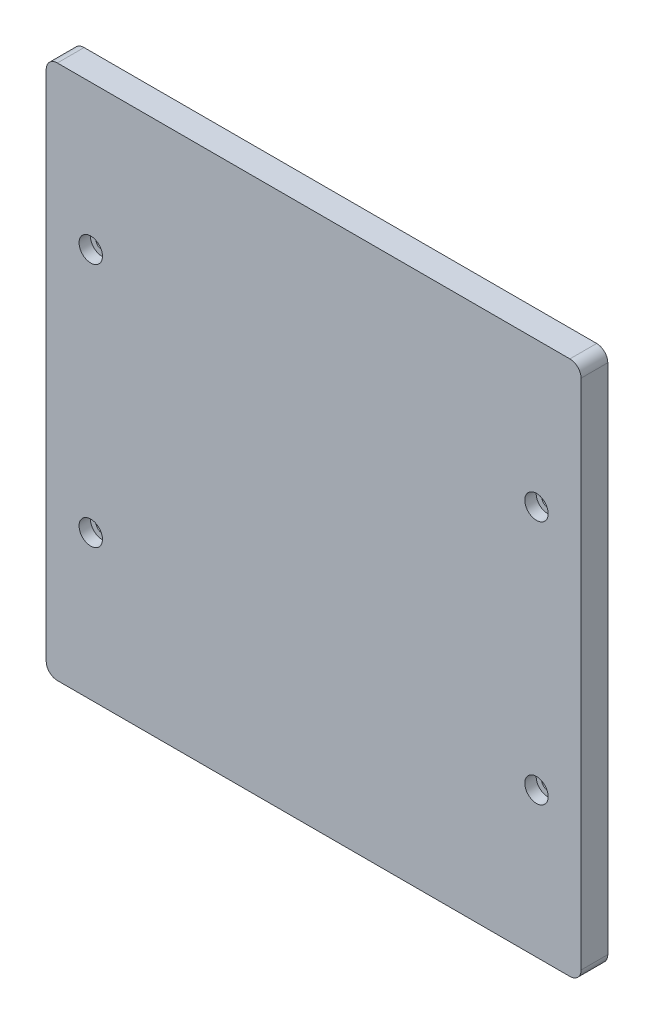
ISO-10303-21;
HEADER;
FILE_DESCRIPTION(('STEP AP214'),'2;1');
FILE_NAME('part.step','',(''),(''),'','','');
FILE_SCHEMA(('AUTOMOTIVE_DESIGN { 1 0 10303 214 1 1 1 1 }'));
ENDSEC;
DATA;
#1=APPLICATION_CONTEXT('core data for automotive mechanical design processes');
#2=APPLICATION_PROTOCOL_DEFINITION('international standard','automotive_design',2000,#1);
#3=PRODUCT_CONTEXT('',#1,'mechanical');
#4=PRODUCT('Part','Part','',(#3));
#5=PRODUCT_RELATED_PRODUCT_CATEGORY('part','',(#4));
#6=PRODUCT_DEFINITION_FORMATION('','',#4);
#7=PRODUCT_DEFINITION_CONTEXT('part definition',#1,'design');
#8=PRODUCT_DEFINITION('design','',#6,#7);
#9=PRODUCT_DEFINITION_SHAPE('','',#8);
#10=(LENGTH_UNIT() NAMED_UNIT(*) SI_UNIT(.MILLI.,.METRE.));
#11=(NAMED_UNIT(*) PLANE_ANGLE_UNIT() SI_UNIT($,.RADIAN.));
#12=(NAMED_UNIT(*) SI_UNIT($,.STERADIAN.) SOLID_ANGLE_UNIT());
#13=UNCERTAINTY_MEASURE_WITH_UNIT(LENGTH_MEASURE(1.E-05),#10,'distance_accuracy_value','');
#14=(GEOMETRIC_REPRESENTATION_CONTEXT(3) GLOBAL_UNCERTAINTY_ASSIGNED_CONTEXT((#13)) GLOBAL_UNIT_ASSIGNED_CONTEXT((#10,
#11,#12)) REPRESENTATION_CONTEXT('',''));
#15=CARTESIAN_POINT('',(0.,0.,0.));
#16=DIRECTION('',(0.,0.,1.));
#17=DIRECTION('',(1.,0.,0.));
#18=AXIS2_PLACEMENT_3D('',#15,#16,#17);
#19=CARTESIAN_POINT('',(100.,55.,186.9));
#20=DIRECTION('',(0.,0.,1.));
#21=DIRECTION('',(1.,0.,0.));
#22=AXIS2_PLACEMENT_3D('',#19,#20,#21);
#23=PLANE('',#22);
#24=CARTESIAN_POINT('',(100.,55.,186.9));
#25=DIRECTION('',(0.,0.,1.));
#26=DIRECTION('',(1.,0.,0.));
#27=AXIS2_PLACEMENT_3D('',#24,#25,#26);
#28=CIRCLE('',#27,2.8);
#29=CARTESIAN_POINT('',(102.8,55.,186.9));
#30=VERTEX_POINT('',#29);
#31=EDGE_CURVE('E241',#30,#30,#28,.T.);
#32=ORIENTED_EDGE('',*,*,#31,.F.);
#33=EDGE_LOOP('',(#32));
#34=FACE_BOUND('',#33,.T.);
#35=CARTESIAN_POINT('',(100.,55.,186.9));
#36=DIRECTION('',(0.,0.,1.));
#37=DIRECTION('',(1.,0.,0.));
#38=AXIS2_PLACEMENT_3D('',#35,#36,#37);
#39=CIRCLE('',#38,5.25);
#40=CARTESIAN_POINT('',(105.25,55.,186.9));
#41=VERTEX_POINT('',#40);
#42=EDGE_CURVE('E11',#41,#41,#39,.T.);
#43=ORIENTED_EDGE('',*,*,#42,.T.);
#44=EDGE_LOOP('',(#43));
#45=FACE_BOUND('',#44,.T.);
#46=ADVANCED_FACE('F16',(#34,#45),#23,.T.);
#47=CARTESIAN_POINT('',(-100.,55.,186.9));
#48=DIRECTION('',(0.,0.,1.));
#49=DIRECTION('',(1.,0.,0.));
#50=AXIS2_PLACEMENT_3D('',#47,#48,#49);
#51=PLANE('',#50);
#52=CARTESIAN_POINT('',(-100.,55.,186.9));
#53=DIRECTION('',(0.,0.,1.));
#54=DIRECTION('',(1.,0.,0.));
#55=AXIS2_PLACEMENT_3D('',#52,#53,#54);
#56=CIRCLE('',#55,2.8);
#57=CARTESIAN_POINT('',(-97.2,55.,186.9));
#58=VERTEX_POINT('',#57);
#59=EDGE_CURVE('E325',#58,#58,#56,.T.);
#60=ORIENTED_EDGE('',*,*,#59,.F.);
#61=EDGE_LOOP('',(#60));
#62=FACE_BOUND('',#61,.T.);
#63=CARTESIAN_POINT('',(-100.,55.,186.9));
#64=DIRECTION('',(0.,0.,1.));
#65=DIRECTION('',(1.,0.,0.));
#66=AXIS2_PLACEMENT_3D('',#63,#64,#65);
#67=CIRCLE('',#66,5.25);
#68=CARTESIAN_POINT('',(-94.75,55.,186.9));
#69=VERTEX_POINT('',#68);
#70=EDGE_CURVE('E39',#69,#69,#67,.T.);
#71=ORIENTED_EDGE('',*,*,#70,.T.);
#72=EDGE_LOOP('',(#71));
#73=FACE_BOUND('',#72,.T.);
#74=ADVANCED_FACE('F389',(#62,#73),#51,.T.);
#75=CARTESIAN_POINT('',(100.,-55.,186.9));
#76=DIRECTION('',(0.,0.,1.));
#77=DIRECTION('',(1.,0.,0.));
#78=AXIS2_PLACEMENT_3D('',#75,#76,#77);
#79=PLANE('',#78);
#80=CARTESIAN_POINT('',(100.,-55.,186.9));
#81=DIRECTION('',(0.,0.,1.));
#82=DIRECTION('',(1.,0.,0.));
#83=AXIS2_PLACEMENT_3D('',#80,#81,#82);
#84=CIRCLE('',#83,2.8);
#85=CARTESIAN_POINT('',(102.8,-55.,186.9));
#86=VERTEX_POINT('',#85);
#87=EDGE_CURVE('E275',#86,#86,#84,.T.);
#88=ORIENTED_EDGE('',*,*,#87,.F.);
#89=EDGE_LOOP('',(#88));
#90=FACE_BOUND('',#89,.T.);
#91=CARTESIAN_POINT('',(100.,-55.,186.9));
#92=DIRECTION('',(0.,0.,1.));
#93=DIRECTION('',(1.,0.,0.));
#94=AXIS2_PLACEMENT_3D('',#91,#92,#93);
#95=CIRCLE('',#94,5.25);
#96=CARTESIAN_POINT('',(105.25,-55.,186.9));
#97=VERTEX_POINT('',#96);
#98=EDGE_CURVE('E301',#97,#97,#95,.T.);
#99=ORIENTED_EDGE('',*,*,#98,.T.);
#100=EDGE_LOOP('',(#99));
#101=FACE_BOUND('',#100,.T.);
#102=ADVANCED_FACE('F394',(#90,#101),#79,.T.);
#103=CARTESIAN_POINT('',(-100.,-55.,186.9));
#104=DIRECTION('',(0.,0.,1.));
#105=DIRECTION('',(1.,0.,0.));
#106=AXIS2_PLACEMENT_3D('',#103,#104,#105);
#107=PLANE('',#106);
#108=CARTESIAN_POINT('',(-100.,-55.,186.9));
#109=DIRECTION('',(0.,0.,1.));
#110=DIRECTION('',(1.,0.,0.));
#111=AXIS2_PLACEMENT_3D('',#108,#109,#110);
#112=CIRCLE('',#111,2.8);
#113=CARTESIAN_POINT('',(-97.2,-55.,186.9));
#114=VERTEX_POINT('',#113);
#115=EDGE_CURVE('E276',#114,#114,#112,.T.);
#116=ORIENTED_EDGE('',*,*,#115,.F.);
#117=EDGE_LOOP('',(#116));
#118=FACE_BOUND('',#117,.T.);
#119=CARTESIAN_POINT('',(-100.,-55.,186.9));
#120=DIRECTION('',(0.,0.,1.));
#121=DIRECTION('',(1.,0.,0.));
#122=AXIS2_PLACEMENT_3D('',#119,#120,#121);
#123=CIRCLE('',#122,5.25);
#124=CARTESIAN_POINT('',(-94.75,-55.,186.9));
#125=VERTEX_POINT('',#124);
#126=EDGE_CURVE('E302',#125,#125,#123,.T.);
#127=ORIENTED_EDGE('',*,*,#126,.T.);
#128=EDGE_LOOP('',(#127));
#129=FACE_BOUND('',#128,.T.);
#130=ADVANCED_FACE('F413',(#118,#129),#107,.T.);
#131=CARTESIAN_POINT('',(100.,55.,186.9));
#132=DIRECTION('',(0.,0.,1.));
#133=DIRECTION('',(1.,0.,0.));
#134=AXIS2_PLACEMENT_3D('',#131,#132,#133);
#135=CYLINDRICAL_SURFACE('',#134,5.25);
#136=DIRECTION('',(0.,0.,1.));
#137=VECTOR('',#136,1.);
#138=CARTESIAN_POINT('',(105.25,55.,186.9));
#139=LINE('',#138,#137);
#140=CARTESIAN_POINT('',(105.25,55.,192.));
#141=VERTEX_POINT('',#140);
#142=EDGE_CURVE('E24',#41,#141,#139,.T.);
#143=ORIENTED_EDGE('',*,*,#142,.F.);
#144=ORIENTED_EDGE('',*,*,#42,.F.);
#145=ORIENTED_EDGE('',*,*,#142,.T.);
#146=CARTESIAN_POINT('',(100.,55.,192.));
#147=DIRECTION('',(0.,0.,1.));
#148=DIRECTION('',(1.,0.,0.));
#149=AXIS2_PLACEMENT_3D('',#146,#147,#148);
#150=CIRCLE('',#149,5.25);
#151=EDGE_CURVE('E224',#141,#141,#150,.T.);
#152=ORIENTED_EDGE('',*,*,#151,.T.);
#153=EDGE_LOOP('',(#143,#144,#145,#152));
#154=FACE_BOUND('',#153,.T.);
#155=ADVANCED_FACE('F345',(#154),#135,.F.);
#156=CARTESIAN_POINT('',(-100.,55.,186.9));
#157=DIRECTION('',(0.,0.,1.));
#158=DIRECTION('',(1.,0.,0.));
#159=AXIS2_PLACEMENT_3D('',#156,#157,#158);
#160=CYLINDRICAL_SURFACE('',#159,5.25);
#161=DIRECTION('',(0.,0.,1.));
#162=VECTOR('',#161,1.);
#163=CARTESIAN_POINT('',(-94.75,55.,186.9));
#164=LINE('',#163,#162);
#165=CARTESIAN_POINT('',(-94.75,55.,192.));
#166=VERTEX_POINT('',#165);
#167=EDGE_CURVE('E337',#69,#166,#164,.T.);
#168=ORIENTED_EDGE('',*,*,#167,.F.);
#169=ORIENTED_EDGE('',*,*,#70,.F.);
#170=ORIENTED_EDGE('',*,*,#167,.T.);
#171=CARTESIAN_POINT('',(-100.,55.,192.));
#172=DIRECTION('',(0.,0.,1.));
#173=DIRECTION('',(1.,0.,0.));
#174=AXIS2_PLACEMENT_3D('',#171,#172,#173);
#175=CIRCLE('',#174,5.25);
#176=EDGE_CURVE('E229',#166,#166,#175,.T.);
#177=ORIENTED_EDGE('',*,*,#176,.T.);
#178=EDGE_LOOP('',(#168,#169,#170,#177));
#179=FACE_BOUND('',#178,.T.);
#180=ADVANCED_FACE('F430',(#179),#160,.F.);
#181=CARTESIAN_POINT('',(100.,-55.,186.9));
#182=DIRECTION('',(0.,0.,1.));
#183=DIRECTION('',(1.,0.,0.));
#184=AXIS2_PLACEMENT_3D('',#181,#182,#183);
#185=CYLINDRICAL_SURFACE('',#184,5.25);
#186=DIRECTION('',(0.,0.,1.));
#187=VECTOR('',#186,1.);
#188=CARTESIAN_POINT('',(105.25,-55.,186.9));
#189=LINE('',#188,#187);
#190=CARTESIAN_POINT('',(105.25,-55.,192.));
#191=VERTEX_POINT('',#190);
#192=EDGE_CURVE('E298',#97,#191,#189,.T.);
#193=ORIENTED_EDGE('',*,*,#192,.F.);
#194=ORIENTED_EDGE('',*,*,#98,.F.);
#195=ORIENTED_EDGE('',*,*,#192,.T.);
#196=CARTESIAN_POINT('',(100.,-55.,192.));
#197=DIRECTION('',(0.,0.,1.));
#198=DIRECTION('',(1.,0.,0.));
#199=AXIS2_PLACEMENT_3D('',#196,#197,#198);
#200=CIRCLE('',#199,5.25);
#201=EDGE_CURVE('E297',#191,#191,#200,.T.);
#202=ORIENTED_EDGE('',*,*,#201,.T.);
#203=EDGE_LOOP('',(#193,#194,#195,#202));
#204=FACE_BOUND('',#203,.T.);
#205=ADVANCED_FACE('F422',(#204),#185,.F.);
#206=CARTESIAN_POINT('',(-100.,-55.,186.9));
#207=DIRECTION('',(0.,0.,1.));
#208=DIRECTION('',(1.,0.,0.));
#209=AXIS2_PLACEMENT_3D('',#206,#207,#208);
#210=CYLINDRICAL_SURFACE('',#209,5.25);
#211=DIRECTION('',(0.,0.,1.));
#212=VECTOR('',#211,1.);
#213=CARTESIAN_POINT('',(-94.75,-55.,186.9));
#214=LINE('',#213,#212);
#215=CARTESIAN_POINT('',(-94.75,-55.,192.));
#216=VERTEX_POINT('',#215);
#217=EDGE_CURVE('E244',#125,#216,#214,.T.);
#218=ORIENTED_EDGE('',*,*,#217,.F.);
#219=ORIENTED_EDGE('',*,*,#126,.F.);
#220=ORIENTED_EDGE('',*,*,#217,.T.);
#221=CARTESIAN_POINT('',(-100.,-55.,192.));
#222=DIRECTION('',(0.,0.,1.));
#223=DIRECTION('',(1.,0.,0.));
#224=AXIS2_PLACEMENT_3D('',#221,#222,#223);
#225=CIRCLE('',#224,5.25);
#226=EDGE_CURVE('E293',#216,#216,#225,.T.);
#227=ORIENTED_EDGE('',*,*,#226,.T.);
#228=EDGE_LOOP('',(#218,#219,#220,#227));
#229=FACE_BOUND('',#228,.T.);
#230=ADVANCED_FACE('F420',(#229),#210,.F.);
#231=CARTESIAN_POINT('',(100.,55.,179.));
#232=DIRECTION('',(0.,0.,1.));
#233=DIRECTION('',(1.,0.,0.));
#234=AXIS2_PLACEMENT_3D('',#231,#232,#233);
#235=CYLINDRICAL_SURFACE('',#234,2.8);
#236=DIRECTION('',(0.,0.,1.));
#237=VECTOR('',#236,1.);
#238=CARTESIAN_POINT('',(102.8,55.,179.));
#239=LINE('',#238,#237);
#240=CARTESIAN_POINT('',(102.8,55.,180.));
#241=VERTEX_POINT('',#240);
#242=EDGE_CURVE('E245',#241,#30,#239,.T.);
#243=ORIENTED_EDGE('',*,*,#242,.F.);
#244=CARTESIAN_POINT('',(100.,55.,180.));
#245=DIRECTION('',(0.,0.,1.));
#246=DIRECTION('',(1.,0.,0.));
#247=AXIS2_PLACEMENT_3D('',#244,#245,#246);
#248=CIRCLE('',#247,2.8);
#249=EDGE_CURVE('E267',#241,#241,#248,.T.);
#250=ORIENTED_EDGE('',*,*,#249,.F.);
#251=ORIENTED_EDGE('',*,*,#242,.T.);
#252=ORIENTED_EDGE('',*,*,#31,.T.);
#253=EDGE_LOOP('',(#243,#250,#251,#252));
#254=FACE_BOUND('',#253,.T.);
#255=ADVANCED_FACE('F399',(#254),#235,.F.);
#256=CARTESIAN_POINT('',(-100.,55.,179.));
#257=DIRECTION('',(0.,0.,1.));
#258=DIRECTION('',(1.,0.,0.));
#259=AXIS2_PLACEMENT_3D('',#256,#257,#258);
#260=CYLINDRICAL_SURFACE('',#259,2.8);
#261=DIRECTION('',(0.,0.,1.));
#262=VECTOR('',#261,1.);
#263=CARTESIAN_POINT('',(-97.2,55.,179.));
#264=LINE('',#263,#262);
#265=CARTESIAN_POINT('',(-97.2,55.,180.));
#266=VERTEX_POINT('',#265);
#267=EDGE_CURVE('E321',#266,#58,#264,.T.);
#268=ORIENTED_EDGE('',*,*,#267,.F.);
#269=CARTESIAN_POINT('',(-100.,55.,180.));
#270=DIRECTION('',(0.,0.,1.));
#271=DIRECTION('',(1.,0.,0.));
#272=AXIS2_PLACEMENT_3D('',#269,#270,#271);
#273=CIRCLE('',#272,2.8);
#274=EDGE_CURVE('E263',#266,#266,#273,.T.);
#275=ORIENTED_EDGE('',*,*,#274,.F.);
#276=ORIENTED_EDGE('',*,*,#267,.T.);
#277=ORIENTED_EDGE('',*,*,#59,.T.);
#278=EDGE_LOOP('',(#268,#275,#276,#277));
#279=FACE_BOUND('',#278,.T.);
#280=ADVANCED_FACE('F428',(#279),#260,.F.);
#281=CARTESIAN_POINT('',(100.,-55.,179.));
#282=DIRECTION('',(0.,0.,1.));
#283=DIRECTION('',(1.,0.,0.));
#284=AXIS2_PLACEMENT_3D('',#281,#282,#283);
#285=CYLINDRICAL_SURFACE('',#284,2.8);
#286=DIRECTION('',(0.,0.,1.));
#287=VECTOR('',#286,1.);
#288=CARTESIAN_POINT('',(102.8,-55.,179.));
#289=LINE('',#288,#287);
#290=CARTESIAN_POINT('',(102.8,-55.,180.));
#291=VERTEX_POINT('',#290);
#292=EDGE_CURVE('E271',#291,#86,#289,.T.);
#293=ORIENTED_EDGE('',*,*,#292,.F.);
#294=CARTESIAN_POINT('',(100.,-55.,180.));
#295=DIRECTION('',(0.,0.,1.));
#296=DIRECTION('',(1.,0.,0.));
#297=AXIS2_PLACEMENT_3D('',#294,#295,#296);
#298=CIRCLE('',#297,2.8);
#299=EDGE_CURVE('E207',#291,#291,#298,.T.);
#300=ORIENTED_EDGE('',*,*,#299,.F.);
#301=ORIENTED_EDGE('',*,*,#292,.T.);
#302=ORIENTED_EDGE('',*,*,#87,.T.);
#303=EDGE_LOOP('',(#293,#300,#301,#302));
#304=FACE_BOUND('',#303,.T.);
#305=ADVANCED_FACE('F517',(#304),#285,.F.);
#306=CARTESIAN_POINT('',(-100.,-55.,179.));
#307=DIRECTION('',(0.,0.,1.));
#308=DIRECTION('',(1.,0.,0.));
#309=AXIS2_PLACEMENT_3D('',#306,#307,#308);
#310=CYLINDRICAL_SURFACE('',#309,2.8);
#311=DIRECTION('',(0.,0.,1.));
#312=VECTOR('',#311,1.);
#313=CARTESIAN_POINT('',(-97.2,-55.,179.));
#314=LINE('',#313,#312);
#315=CARTESIAN_POINT('',(-97.2,-55.,180.));
#316=VERTEX_POINT('',#315);
#317=EDGE_CURVE('E217',#316,#114,#314,.T.);
#318=ORIENTED_EDGE('',*,*,#317,.F.);
#319=CARTESIAN_POINT('',(-100.,-55.,180.));
#320=DIRECTION('',(0.,0.,1.));
#321=DIRECTION('',(1.,0.,0.));
#322=AXIS2_PLACEMENT_3D('',#319,#320,#321);
#323=CIRCLE('',#322,2.8);
#324=EDGE_CURVE('E204',#316,#316,#323,.T.);
#325=ORIENTED_EDGE('',*,*,#324,.F.);
#326=ORIENTED_EDGE('',*,*,#317,.T.);
#327=ORIENTED_EDGE('',*,*,#115,.T.);
#328=EDGE_LOOP('',(#318,#325,#326,#327));
#329=FACE_BOUND('',#328,.T.);
#330=ADVANCED_FACE('F410',(#329),#310,.F.);
#331=CARTESIAN_POINT('',(120.,-115.,180.));
#332=DIRECTION('',(-1.,0.,0.));
#333=DIRECTION('',(0.,0.,1.));
#334=AXIS2_PLACEMENT_3D('',#331,#332,#333);
#335=PLANE('',#334);
#336=DIRECTION('',(0.,1.,0.));
#337=VECTOR('',#336,1.);
#338=CARTESIAN_POINT('',(120.,0.,180.));
#339=LINE('',#338,#337);
#340=CARTESIAN_POINT('',(120.,-115.,180.));
#341=VERTEX_POINT('',#340);
#342=CARTESIAN_POINT('',(120.,115.,180.));
#343=VERTEX_POINT('',#342);
#344=EDGE_CURVE('E211',#341,#343,#339,.T.);
#345=ORIENTED_EDGE('',*,*,#344,.T.);
#346=DIRECTION('',(0.,0.,1.));
#347=VECTOR('',#346,1.);
#348=CARTESIAN_POINT('',(120.,115.,180.));
#349=LINE('',#348,#347);
#350=CARTESIAN_POINT('',(120.,115.,192.));
#351=VERTEX_POINT('',#350);
#352=EDGE_CURVE('E214',#343,#351,#349,.T.);
#353=ORIENTED_EDGE('',*,*,#352,.T.);
#354=DIRECTION('',(0.,1.,0.));
#355=VECTOR('',#354,1.);
#356=CARTESIAN_POINT('',(120.,0.,192.));
#357=LINE('',#356,#355);
#358=CARTESIAN_POINT('',(120.,-115.,192.));
#359=VERTEX_POINT('',#358);
#360=EDGE_CURVE('E250',#359,#351,#357,.T.);
#361=ORIENTED_EDGE('',*,*,#360,.F.);
#362=DIRECTION('',(0.,0.,1.));
#363=VECTOR('',#362,1.);
#364=CARTESIAN_POINT('',(120.,-115.,180.));
#365=LINE('',#364,#363);
#366=EDGE_CURVE('E218',#341,#359,#365,.T.);
#367=ORIENTED_EDGE('',*,*,#366,.F.);
#368=EDGE_LOOP('',(#345,#353,#361,#367));
#369=FACE_BOUND('',#368,.T.);
#370=ADVANCED_FACE('F374',(#369),#335,.F.);
#371=CARTESIAN_POINT('',(115.,115.,180.));
#372=DIRECTION('',(0.,0.,-1.));
#373=DIRECTION('',(-1.,0.,0.));
#374=AXIS2_PLACEMENT_3D('',#371,#372,#373);
#375=CYLINDRICAL_SURFACE('',#374,5.);
#376=DIRECTION('',(0.,0.,1.));
#377=VECTOR('',#376,1.);
#378=CARTESIAN_POINT('',(115.,120.,180.));
#379=LINE('',#378,#377);
#380=CARTESIAN_POINT('',(115.,120.,180.));
#381=VERTEX_POINT('',#380);
#382=CARTESIAN_POINT('',(115.,120.,192.));
#383=VERTEX_POINT('',#382);
#384=EDGE_CURVE('E311',#381,#383,#379,.T.);
#385=ORIENTED_EDGE('',*,*,#384,.T.);
#386=CARTESIAN_POINT('',(115.,115.,192.));
#387=DIRECTION('',(0.,0.,-1.));
#388=DIRECTION('',(-1.,0.,0.));
#389=AXIS2_PLACEMENT_3D('',#386,#387,#388);
#390=CIRCLE('',#389,5.);
#391=EDGE_CURVE('E285',#383,#351,#390,.T.);
#392=ORIENTED_EDGE('',*,*,#391,.T.);
#393=ORIENTED_EDGE('',*,*,#352,.F.);
#394=CARTESIAN_POINT('',(115.,115.,180.));
#395=DIRECTION('',(0.,0.,-1.));
#396=DIRECTION('',(-1.,0.,0.));
#397=AXIS2_PLACEMENT_3D('',#394,#395,#396);
#398=CIRCLE('',#397,5.);
#399=EDGE_CURVE('E208',#381,#343,#398,.T.);
#400=ORIENTED_EDGE('',*,*,#399,.F.);
#401=EDGE_LOOP('',(#385,#392,#393,#400));
#402=FACE_BOUND('',#401,.T.);
#403=ADVANCED_FACE('F371',(#402),#375,.T.);
#404=CARTESIAN_POINT('',(115.,-115.,180.));
#405=DIRECTION('',(0.,0.,-1.));
#406=DIRECTION('',(-1.,0.,0.));
#407=AXIS2_PLACEMENT_3D('',#404,#405,#406);
#408=CYLINDRICAL_SURFACE('',#407,5.);
#409=ORIENTED_EDGE('',*,*,#366,.T.);
#410=CARTESIAN_POINT('',(115.,-115.,192.));
#411=DIRECTION('',(0.,0.,-1.));
#412=DIRECTION('',(-1.,0.,0.));
#413=AXIS2_PLACEMENT_3D('',#410,#411,#412);
#414=CIRCLE('',#413,5.);
#415=CARTESIAN_POINT('',(115.,-120.,192.));
#416=VERTEX_POINT('',#415);
#417=EDGE_CURVE('E246',#359,#416,#414,.T.);
#418=ORIENTED_EDGE('',*,*,#417,.T.);
#419=DIRECTION('',(0.,0.,1.));
#420=VECTOR('',#419,1.);
#421=CARTESIAN_POINT('',(115.,-120.,180.));
#422=LINE('',#421,#420);
#423=CARTESIAN_POINT('',(115.,-120.,180.));
#424=VERTEX_POINT('',#423);
#425=EDGE_CURVE('E228',#424,#416,#422,.T.);
#426=ORIENTED_EDGE('',*,*,#425,.F.);
#427=CARTESIAN_POINT('',(115.,-115.,180.));
#428=DIRECTION('',(0.,0.,-1.));
#429=DIRECTION('',(-1.,0.,0.));
#430=AXIS2_PLACEMENT_3D('',#427,#428,#429);
#431=CIRCLE('',#430,5.);
#432=EDGE_CURVE('E232',#341,#424,#431,.T.);
#433=ORIENTED_EDGE('',*,*,#432,.F.);
#434=EDGE_LOOP('',(#409,#418,#426,#433));
#435=FACE_BOUND('',#434,.T.);
#436=ADVANCED_FACE('F377',(#435),#408,.T.);
#437=CARTESIAN_POINT('',(-115.,120.,180.));
#438=DIRECTION('',(0.,1.,0.));
#439=DIRECTION('',(1.,0.,0.));
#440=AXIS2_PLACEMENT_3D('',#437,#438,#439);
#441=PLANE('',#440);
#442=DIRECTION('',(0.,0.,1.));
#443=VECTOR('',#442,1.);
#444=CARTESIAN_POINT('',(-115.,120.,180.));
#445=LINE('',#444,#443);
#446=CARTESIAN_POINT('',(-115.,120.,180.));
#447=VERTEX_POINT('',#446);
#448=CARTESIAN_POINT('',(-115.,120.,192.));
#449=VERTEX_POINT('',#448);
#450=EDGE_CURVE('E240',#447,#449,#445,.T.);
#451=ORIENTED_EDGE('',*,*,#450,.T.);
#452=DIRECTION('',(1.,0.,0.));
#453=VECTOR('',#452,1.);
#454=CARTESIAN_POINT('',(0.,120.,192.));
#455=LINE('',#454,#453);
#456=EDGE_CURVE('E289',#449,#383,#455,.T.);
#457=ORIENTED_EDGE('',*,*,#456,.T.);
#458=ORIENTED_EDGE('',*,*,#384,.F.);
#459=DIRECTION('',(1.,0.,0.));
#460=VECTOR('',#459,1.);
#461=CARTESIAN_POINT('',(0.,120.,180.));
#462=LINE('',#461,#460);
#463=EDGE_CURVE('E212',#447,#381,#462,.T.);
#464=ORIENTED_EDGE('',*,*,#463,.F.);
#465=EDGE_LOOP('',(#451,#457,#458,#464));
#466=FACE_BOUND('',#465,.T.);
#467=ADVANCED_FACE('F369',(#466),#441,.T.);
#468=CARTESIAN_POINT('',(-115.,-120.,180.));
#469=DIRECTION('',(0.,1.,0.));
#470=DIRECTION('',(1.,0.,0.));
#471=AXIS2_PLACEMENT_3D('',#468,#469,#470);
#472=PLANE('',#471);
#473=DIRECTION('',(1.,0.,0.));
#474=VECTOR('',#473,1.);
#475=CARTESIAN_POINT('',(0.,-120.,180.));
#476=LINE('',#475,#474);
#477=CARTESIAN_POINT('',(-115.,-120.,180.));
#478=VERTEX_POINT('',#477);
#479=EDGE_CURVE('E171',#478,#424,#476,.T.);
#480=ORIENTED_EDGE('',*,*,#479,.T.);
#481=ORIENTED_EDGE('',*,*,#425,.T.);
#482=DIRECTION('',(1.,0.,0.));
#483=VECTOR('',#482,1.);
#484=CARTESIAN_POINT('',(0.,-120.,192.));
#485=LINE('',#484,#483);
#486=CARTESIAN_POINT('',(-115.,-120.,192.));
#487=VERTEX_POINT('',#486);
#488=EDGE_CURVE('E251',#487,#416,#485,.T.);
#489=ORIENTED_EDGE('',*,*,#488,.F.);
#490=DIRECTION('',(0.,0.,1.));
#491=VECTOR('',#490,1.);
#492=CARTESIAN_POINT('',(-115.,-120.,180.));
#493=LINE('',#492,#491);
#494=EDGE_CURVE('E188',#478,#487,#493,.T.);
#495=ORIENTED_EDGE('',*,*,#494,.F.);
#496=EDGE_LOOP('',(#480,#481,#489,#495));
#497=FACE_BOUND('',#496,.T.);
#498=ADVANCED_FACE('F351',(#497),#472,.F.);
#499=CARTESIAN_POINT('',(0.,0.,192.));
#500=DIRECTION('',(0.,0.,1.));
#501=DIRECTION('',(1.,0.,0.));
#502=AXIS2_PLACEMENT_3D('',#499,#500,#501);
#503=PLANE('',#502);
#504=ORIENTED_EDGE('',*,*,#151,.F.);
#505=EDGE_LOOP('',(#504));
#506=FACE_BOUND('',#505,.T.);
#507=ORIENTED_EDGE('',*,*,#176,.F.);
#508=EDGE_LOOP('',(#507));
#509=FACE_BOUND('',#508,.T.);
#510=ORIENTED_EDGE('',*,*,#201,.F.);
#511=EDGE_LOOP('',(#510));
#512=FACE_BOUND('',#511,.T.);
#513=ORIENTED_EDGE('',*,*,#226,.F.);
#514=EDGE_LOOP('',(#513));
#515=FACE_BOUND('',#514,.T.);
#516=DIRECTION('',(0.,1.,0.));
#517=VECTOR('',#516,1.);
#518=CARTESIAN_POINT('',(-120.,0.,192.));
#519=LINE('',#518,#517);
#520=CARTESIAN_POINT('',(-120.,-115.,192.));
#521=VERTEX_POINT('',#520);
#522=CARTESIAN_POINT('',(-120.,115.,192.));
#523=VERTEX_POINT('',#522);
#524=EDGE_CURVE('E194',#521,#523,#519,.T.);
#525=ORIENTED_EDGE('',*,*,#524,.F.);
#526=CARTESIAN_POINT('',(-115.,-115.,192.));
#527=DIRECTION('',(0.,0.,-1.));
#528=DIRECTION('',(-1.,0.,0.));
#529=AXIS2_PLACEMENT_3D('',#526,#527,#528);
#530=CIRCLE('',#529,5.);
#531=EDGE_CURVE('E178',#487,#521,#530,.T.);
#532=ORIENTED_EDGE('',*,*,#531,.F.);
#533=ORIENTED_EDGE('',*,*,#488,.T.);
#534=ORIENTED_EDGE('',*,*,#417,.F.);
#535=ORIENTED_EDGE('',*,*,#360,.T.);
#536=ORIENTED_EDGE('',*,*,#391,.F.);
#537=ORIENTED_EDGE('',*,*,#456,.F.);
#538=CARTESIAN_POINT('',(-115.,115.,192.));
#539=DIRECTION('',(0.,0.,-1.));
#540=DIRECTION('',(-1.,0.,0.));
#541=AXIS2_PLACEMENT_3D('',#538,#539,#540);
#542=CIRCLE('',#541,5.);
#543=EDGE_CURVE('E177',#523,#449,#542,.T.);
#544=ORIENTED_EDGE('',*,*,#543,.F.);
#545=EDGE_LOOP('',(#525,#532,#533,#534,#535,#536,#537,#544));
#546=FACE_BOUND('',#545,.T.);
#547=ADVANCED_FACE('F348',(#506,#509,#512,#515,#546),#503,.T.);
#548=CARTESIAN_POINT('',(0.,0.,180.));
#549=DIRECTION('',(0.,0.,1.));
#550=DIRECTION('',(1.,0.,0.));
#551=AXIS2_PLACEMENT_3D('',#548,#549,#550);
#552=PLANE('',#551);
#553=ORIENTED_EDGE('',*,*,#249,.T.);
#554=EDGE_LOOP('',(#553));
#555=FACE_BOUND('',#554,.T.);
#556=ORIENTED_EDGE('',*,*,#274,.T.);
#557=EDGE_LOOP('',(#556));
#558=FACE_BOUND('',#557,.T.);
#559=ORIENTED_EDGE('',*,*,#299,.T.);
#560=EDGE_LOOP('',(#559));
#561=FACE_BOUND('',#560,.T.);
#562=ORIENTED_EDGE('',*,*,#324,.T.);
#563=EDGE_LOOP('',(#562));
#564=FACE_BOUND('',#563,.T.);
#565=CARTESIAN_POINT('',(-115.,115.,180.));
#566=DIRECTION('',(0.,0.,-1.));
#567=DIRECTION('',(-1.,0.,0.));
#568=AXIS2_PLACEMENT_3D('',#565,#566,#567);
#569=CIRCLE('',#568,5.);
#570=CARTESIAN_POINT('',(-120.,115.,180.));
#571=VERTEX_POINT('',#570);
#572=EDGE_CURVE('E203',#571,#447,#569,.T.);
#573=ORIENTED_EDGE('',*,*,#572,.T.);
#574=ORIENTED_EDGE('',*,*,#463,.T.);
#575=ORIENTED_EDGE('',*,*,#399,.T.);
#576=ORIENTED_EDGE('',*,*,#344,.F.);
#577=ORIENTED_EDGE('',*,*,#432,.T.);
#578=ORIENTED_EDGE('',*,*,#479,.F.);
#579=CARTESIAN_POINT('',(-115.,-115.,180.));
#580=DIRECTION('',(0.,0.,-1.));
#581=DIRECTION('',(-1.,0.,0.));
#582=AXIS2_PLACEMENT_3D('',#579,#580,#581);
#583=CIRCLE('',#582,5.);
#584=CARTESIAN_POINT('',(-120.,-115.,180.));
#585=VERTEX_POINT('',#584);
#586=EDGE_CURVE('E163',#478,#585,#583,.T.);
#587=ORIENTED_EDGE('',*,*,#586,.T.);
#588=DIRECTION('',(0.,1.,0.));
#589=VECTOR('',#588,1.);
#590=CARTESIAN_POINT('',(-120.,0.,180.));
#591=LINE('',#590,#589);
#592=EDGE_CURVE('E167',#585,#571,#591,.T.);
#593=ORIENTED_EDGE('',*,*,#592,.T.);
#594=EDGE_LOOP('',(#573,#574,#575,#576,#577,#578,#587,#593));
#595=FACE_BOUND('',#594,.T.);
#596=ADVANCED_FACE('F166',(#555,#558,#561,#564,#595),#552,.F.);
#597=CARTESIAN_POINT('',(-115.,115.,180.));
#598=DIRECTION('',(0.,0.,-1.));
#599=DIRECTION('',(-1.,0.,0.));
#600=AXIS2_PLACEMENT_3D('',#597,#598,#599);
#601=CYLINDRICAL_SURFACE('',#600,5.);
#602=DIRECTION('',(0.,0.,1.));
#603=VECTOR('',#602,1.);
#604=CARTESIAN_POINT('',(-120.,115.,180.));
#605=LINE('',#604,#603);
#606=EDGE_CURVE('E186',#571,#523,#605,.T.);
#607=ORIENTED_EDGE('',*,*,#606,.T.);
#608=ORIENTED_EDGE('',*,*,#543,.T.);
#609=ORIENTED_EDGE('',*,*,#450,.F.);
#610=ORIENTED_EDGE('',*,*,#572,.F.);
#611=EDGE_LOOP('',(#607,#608,#609,#610));
#612=FACE_BOUND('',#611,.T.);
#613=ADVANCED_FACE('F362',(#612),#601,.T.);
#614=CARTESIAN_POINT('',(-115.,-115.,180.));
#615=DIRECTION('',(0.,0.,-1.));
#616=DIRECTION('',(-1.,0.,0.));
#617=AXIS2_PLACEMENT_3D('',#614,#615,#616);
#618=CYLINDRICAL_SURFACE('',#617,5.);
#619=ORIENTED_EDGE('',*,*,#494,.T.);
#620=ORIENTED_EDGE('',*,*,#531,.T.);
#621=DIRECTION('',(0.,0.,1.));
#622=VECTOR('',#621,1.);
#623=CARTESIAN_POINT('',(-120.,-115.,180.));
#624=LINE('',#623,#622);
#625=EDGE_CURVE('E184',#585,#521,#624,.T.);
#626=ORIENTED_EDGE('',*,*,#625,.F.);
#627=ORIENTED_EDGE('',*,*,#586,.F.);
#628=EDGE_LOOP('',(#619,#620,#626,#627));
#629=FACE_BOUND('',#628,.T.);
#630=ADVANCED_FACE('F190',(#629),#618,.T.);
#631=CARTESIAN_POINT('',(-120.,-115.,180.));
#632=DIRECTION('',(-1.,0.,0.));
#633=DIRECTION('',(0.,0.,1.));
#634=AXIS2_PLACEMENT_3D('',#631,#632,#633);
#635=PLANE('',#634);
#636=ORIENTED_EDGE('',*,*,#625,.T.);
#637=ORIENTED_EDGE('',*,*,#524,.T.);
#638=ORIENTED_EDGE('',*,*,#606,.F.);
#639=ORIENTED_EDGE('',*,*,#592,.F.);
#640=EDGE_LOOP('',(#636,#637,#638,#639));
#641=FACE_BOUND('',#640,.T.);
#642=ADVANCED_FACE('F182',(#641),#635,.T.);
#643=CLOSED_SHELL('',(#46,#74,#102,#130,#155,#180,#205,#230,#255,#280,#305,#330,#370,#403,#436,
#467,#498,#547,#596,#613,#630,#642));
#644=MANIFOLD_SOLID_BREP('B1',#643);
#645=ADVANCED_BREP_SHAPE_REPRESENTATION('',(#18,#644),#14);
#646=SHAPE_DEFINITION_REPRESENTATION(#9,#645);
ENDSEC;
END-ISO-10303-21;
